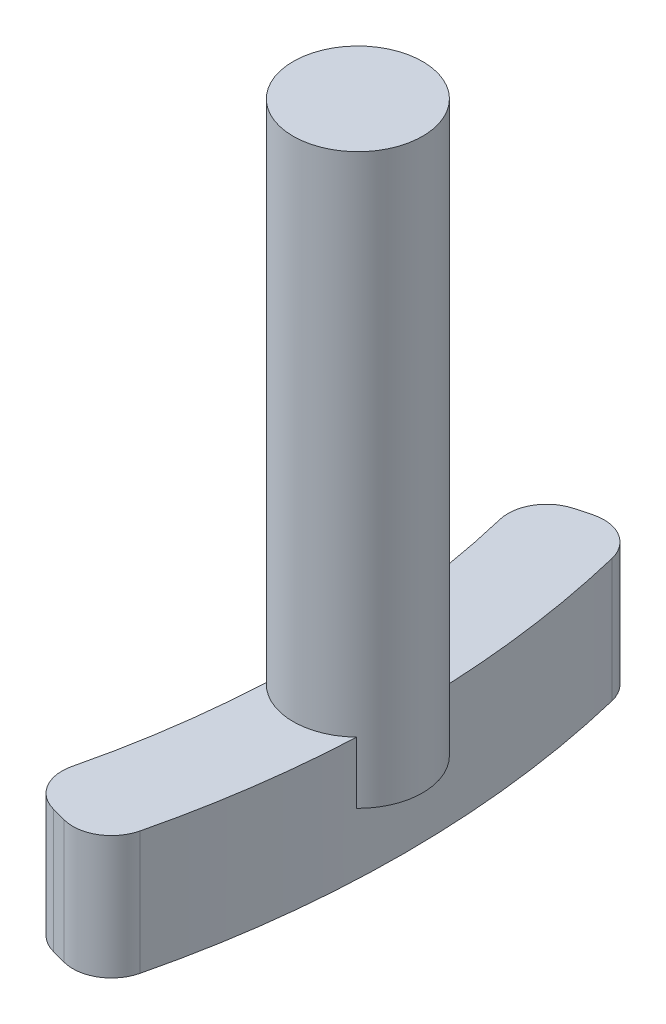
ISO-10303-21;
HEADER;
FILE_DESCRIPTION(('STEP AP214'),'2;1');
FILE_NAME('part.step','',(''),(''),'','','');
FILE_SCHEMA(('AUTOMOTIVE_DESIGN { 1 0 10303 214 1 1 1 1 }'));
ENDSEC;
DATA;
#1=APPLICATION_CONTEXT('core data for automotive mechanical design processes');
#2=APPLICATION_PROTOCOL_DEFINITION('international standard','automotive_design',2000,#1);
#3=PRODUCT_CONTEXT('',#1,'mechanical');
#4=PRODUCT('Part','Part','',(#3));
#5=PRODUCT_RELATED_PRODUCT_CATEGORY('part','',(#4));
#6=PRODUCT_DEFINITION_FORMATION('','',#4);
#7=PRODUCT_DEFINITION_CONTEXT('part definition',#1,'design');
#8=PRODUCT_DEFINITION('design','',#6,#7);
#9=PRODUCT_DEFINITION_SHAPE('','',#8);
#10=(LENGTH_UNIT() NAMED_UNIT(*) SI_UNIT(.MILLI.,.METRE.));
#11=(NAMED_UNIT(*) PLANE_ANGLE_UNIT() SI_UNIT($,.RADIAN.));
#12=(NAMED_UNIT(*) SI_UNIT($,.STERADIAN.) SOLID_ANGLE_UNIT());
#13=UNCERTAINTY_MEASURE_WITH_UNIT(LENGTH_MEASURE(1.E-05),#10,'distance_accuracy_value','');
#14=(GEOMETRIC_REPRESENTATION_CONTEXT(3) GLOBAL_UNCERTAINTY_ASSIGNED_CONTEXT((#13)) GLOBAL_UNIT_ASSIGNED_CONTEXT((#10,
#11,#12)) REPRESENTATION_CONTEXT('',''));
#15=CARTESIAN_POINT('',(0.,0.,0.));
#16=DIRECTION('',(0.,0.,1.));
#17=DIRECTION('',(1.,0.,0.));
#18=AXIS2_PLACEMENT_3D('',#15,#16,#17);
#19=CARTESIAN_POINT('',(-30.5687487202427,4.,2.05143520629854E-13));
#20=DIRECTION('',(0.,-1.,0.));
#21=DIRECTION('',(0.,0.,-1.));
#22=AXIS2_PLACEMENT_3D('',#19,#20,#21);
#23=CYLINDRICAL_SURFACE('',#22,29.4999999999999);
#24=DIRECTION('',(0.,-1.,0.));
#25=VECTOR('',#24,1.);
#26=CARTESIAN_POINT('',(-1.10358742992017,11.22,1.43327252651965));
#27=LINE('',#26,#25);
#28=CARTESIAN_POINT('',(-1.10358742992019,2.,1.43327252651963));
#29=VERTEX_POINT('',#28);
#30=CARTESIAN_POINT('',(-1.1035874299202,4.,1.43327252651967));
#31=VERTEX_POINT('',#30);
#32=EDGE_CURVE('E48',#29,#31,#27,.F.);
#33=ORIENTED_EDGE('',*,*,#32,.F.);
#34=CARTESIAN_POINT('',(-30.5687487202427,2.,2.05143520629854E-13));
#35=DIRECTION('',(0.,1.,0.));
#36=DIRECTION('',(0.,0.,1.));
#37=AXIS2_PLACEMENT_3D('',#34,#35,#36);
#38=CIRCLE('',#37,29.4999999999999);
#39=CARTESIAN_POINT('',(-1.10358742992021,2.,-1.4332725265196));
#40=VERTEX_POINT('',#39);
#41=EDGE_CURVE('E151',#40,#29,#38,.F.);
#42=ORIENTED_EDGE('',*,*,#41,.F.);
#43=DIRECTION('',(0.,-1.,0.));
#44=VECTOR('',#43,1.);
#45=CARTESIAN_POINT('',(-1.10358742992019,11.22,-1.43327252651963));
#46=LINE('',#45,#44);
#47=CARTESIAN_POINT('',(-1.10358742992021,4.,-1.43327252651965));
#48=VERTEX_POINT('',#47);
#49=EDGE_CURVE('E221',#48,#40,#46,.T.);
#50=ORIENTED_EDGE('',*,*,#49,.F.);
#51=CARTESIAN_POINT('',(-30.5687487202427,4.,2.05143520629854E-13));
#52=DIRECTION('',(0.,-1.,0.));
#53=DIRECTION('',(0.,0.,1.));
#54=AXIS2_PLACEMENT_3D('',#51,#52,#53);
#55=CIRCLE('',#54,29.4999999999999);
#56=CARTESIAN_POINT('',(-1.8961902001021,4.,-6.93789506328148));
#57=VERTEX_POINT('',#56);
#58=EDGE_CURVE('E99',#57,#48,#55,.T.);
#59=ORIENTED_EDGE('',*,*,#58,.F.);
#60=DIRECTION('',(0.,-1.,0.));
#61=VECTOR('',#60,1.);
#62=CARTESIAN_POINT('',(-1.8961902001021,4.,-6.93789506328148));
#63=LINE('',#62,#61);
#64=CARTESIAN_POINT('',(-1.8961902001021,0.,-6.93789506328148));
#65=VERTEX_POINT('',#64);
#66=EDGE_CURVE('E176',#57,#65,#63,.T.);
#67=ORIENTED_EDGE('',*,*,#66,.T.);
#68=CARTESIAN_POINT('',(-30.5687487202427,0.,2.05143520629854E-13));
#69=DIRECTION('',(0.,-1.,0.));
#70=DIRECTION('',(0.,0.,1.));
#71=AXIS2_PLACEMENT_3D('',#68,#69,#70);
#72=CIRCLE('',#71,29.4999999999999);
#73=CARTESIAN_POINT('',(-1.8961902001028,0.,6.9378950632813));
#74=VERTEX_POINT('',#73);
#75=EDGE_CURVE('E150',#65,#74,#72,.T.);
#76=ORIENTED_EDGE('',*,*,#75,.T.);
#77=DIRECTION('',(0.,-1.,0.));
#78=VECTOR('',#77,1.);
#79=CARTESIAN_POINT('',(-1.8961902001028,4.,6.9378950632813));
#80=LINE('',#79,#78);
#81=CARTESIAN_POINT('',(-1.8961902001028,4.,6.9378950632813));
#82=VERTEX_POINT('',#81);
#83=EDGE_CURVE('E173',#82,#74,#80,.T.);
#84=ORIENTED_EDGE('',*,*,#83,.F.);
#85=EDGE_CURVE('E181',#31,#82,#55,.T.);
#86=ORIENTED_EDGE('',*,*,#85,.F.);
#87=EDGE_LOOP('',(#33,#42,#50,#59,#67,#76,#84,#86));
#88=FACE_BOUND('',#87,.T.);
#89=ADVANCED_FACE('F33',(#88),#23,.F.);
#90=CARTESIAN_POINT('',(-30.5687487202427,4.,2.05143520629854E-13));
#91=DIRECTION('',(0.,-1.,0.));
#92=DIRECTION('',(0.,0.,-1.));
#93=AXIS2_PLACEMENT_3D('',#90,#91,#92);
#94=CYLINDRICAL_SURFACE('',#93,32.5);
#95=DIRECTION('',(0.,-1.,0.));
#96=VECTOR('',#95,1.);
#97=CARTESIAN_POINT('',(1.89641257007984,11.22,1.50442759657619));
#98=LINE('',#97,#96);
#99=CARTESIAN_POINT('',(1.89641257007988,4.,1.50442759657623));
#100=VERTEX_POINT('',#99);
#101=CARTESIAN_POINT('',(1.89641257007988,2.,1.50442759657614));
#102=VERTEX_POINT('',#101);
#103=EDGE_CURVE('E204',#100,#102,#98,.T.);
#104=ORIENTED_EDGE('',*,*,#103,.F.);
#105=CARTESIAN_POINT('',(-30.5687487202427,4.,2.05143520629854E-13));
#106=DIRECTION('',(0.,1.,0.));
#107=DIRECTION('',(0.,0.,1.));
#108=AXIS2_PLACEMENT_3D('',#105,#106,#107);
#109=CIRCLE('',#108,32.5);
#110=CARTESIAN_POINT('',(1.01667712130941,4.,7.65577392611712));
#111=VERTEX_POINT('',#110);
#112=EDGE_CURVE('E125',#111,#100,#109,.T.);
#113=ORIENTED_EDGE('',*,*,#112,.F.);
#114=DIRECTION('',(0.,-1.,0.));
#115=VECTOR('',#114,1.);
#116=CARTESIAN_POINT('',(1.01667712130941,4.,7.65577392611712));
#117=LINE('',#116,#115);
#118=CARTESIAN_POINT('',(1.01667712130941,0.,7.65577392611712));
#119=VERTEX_POINT('',#118);
#120=EDGE_CURVE('E137',#111,#119,#117,.T.);
#121=ORIENTED_EDGE('',*,*,#120,.T.);
#122=CARTESIAN_POINT('',(-30.5687487202427,0.,2.05143520629854E-13));
#123=DIRECTION('',(0.,1.,0.));
#124=DIRECTION('',(0.,0.,1.));
#125=AXIS2_PLACEMENT_3D('',#122,#123,#124);
#126=CIRCLE('',#125,32.5);
#127=CARTESIAN_POINT('',(1.01667712130929,0.,-7.65577392611716));
#128=VERTEX_POINT('',#127);
#129=EDGE_CURVE('E134',#119,#128,#126,.T.);
#130=ORIENTED_EDGE('',*,*,#129,.T.);
#131=DIRECTION('',(0.,-1.,0.));
#132=VECTOR('',#131,1.);
#133=CARTESIAN_POINT('',(1.01667712130929,4.,-7.65577392611716));
#134=LINE('',#133,#132);
#135=CARTESIAN_POINT('',(1.01667712130929,4.,-7.65577392611716));
#136=VERTEX_POINT('',#135);
#137=EDGE_CURVE('E129',#136,#128,#134,.T.);
#138=ORIENTED_EDGE('',*,*,#137,.F.);
#139=CARTESIAN_POINT('',(1.89641257007986,4.,-1.50442759657624));
#140=VERTEX_POINT('',#139);
#141=EDGE_CURVE('E116',#140,#136,#109,.T.);
#142=ORIENTED_EDGE('',*,*,#141,.F.);
#143=DIRECTION('',(0.,-1.,0.));
#144=VECTOR('',#143,1.);
#145=CARTESIAN_POINT('',(1.89641257007982,11.22,-1.5044275965762));
#146=LINE('',#145,#144);
#147=CARTESIAN_POINT('',(1.89641257007986,2.,-1.50442759657616));
#148=VERTEX_POINT('',#147);
#149=EDGE_CURVE('E212',#148,#140,#146,.F.);
#150=ORIENTED_EDGE('',*,*,#149,.F.);
#151=CARTESIAN_POINT('',(-30.5687487202427,2.,2.05143520629854E-13));
#152=DIRECTION('',(0.,1.,0.));
#153=DIRECTION('',(0.,0.,1.));
#154=AXIS2_PLACEMENT_3D('',#151,#152,#153);
#155=CIRCLE('',#154,32.5);
#156=EDGE_CURVE('E11',#102,#148,#155,.T.);
#157=ORIENTED_EDGE('',*,*,#156,.F.);
#158=EDGE_LOOP('',(#104,#113,#121,#130,#138,#142,#150,#157));
#159=FACE_BOUND('',#158,.T.);
#160=ADVANCED_FACE('F131',(#159),#94,.T.);
#161=CARTESIAN_POINT('',(-0.681251279757095,4.,-7.23187366765784));
#162=DIRECTION('',(0.,1.,0.));
#163=DIRECTION('',(0.,0.,1.));
#164=AXIS2_PLACEMENT_3D('',#161,#162,#163);
#165=PLANE('',#164);
#166=ORIENTED_EDGE('',*,*,#58,.T.);
#167=CARTESIAN_POINT('',(0.431251279757166,4.,0.));
#168=DIRECTION('',(0.,1.,0.));
#169=DIRECTION('',(0.,0.,1.));
#170=AXIS2_PLACEMENT_3D('',#167,#168,#169);
#171=CIRCLE('',#170,2.1);
#172=EDGE_CURVE('E41',#48,#140,#171,.F.);
#173=ORIENTED_EDGE('',*,*,#172,.T.);
#174=ORIENTED_EDGE('',*,*,#141,.T.);
#175=CARTESIAN_POINT('',(-0.198146949519636,4.,-7.36132108280495));
#176=DIRECTION('',(0.,1.,0.));
#177=DIRECTION('',(0.,0.,-1.));
#178=AXIS2_PLACEMENT_3D('',#175,#176,#177);
#179=CIRCLE('',#178,1.25);
#180=CARTESIAN_POINT('',(-0.521670755897788,4.,-8.56872836566629));
#181=VERTEX_POINT('',#180);
#182=EDGE_CURVE('E120',#136,#181,#179,.T.);
#183=ORIENTED_EDGE('',*,*,#182,.T.);
#184=DIRECTION('',(-0.965925826289066,0.,0.25881904510253));
#185=VECTOR('',#184,1.);
#186=CARTESIAN_POINT('',(-1.00477508613525,4.,-8.43928095051918));
#187=LINE('',#186,#185);
#188=CARTESIAN_POINT('',(-1.00477508613525,4.,-8.43928095051918));
#189=VERTEX_POINT('',#188);
#190=EDGE_CURVE('E57',#181,#189,#187,.T.);
#191=ORIENTED_EDGE('',*,*,#190,.T.);
#192=CARTESIAN_POINT('',(-0.681251279757095,4.,-7.23187366765784));
#193=DIRECTION('',(0.,1.,0.));
#194=DIRECTION('',(0.,0.,1.));
#195=AXIS2_PLACEMENT_3D('',#192,#193,#194);
#196=CIRCLE('',#195,1.25);
#197=EDGE_CURVE('E163',#189,#57,#196,.T.);
#198=ORIENTED_EDGE('',*,*,#197,.T.);
#199=EDGE_LOOP('',(#166,#173,#174,#183,#191,#198));
#200=FACE_BOUND('',#199,.T.);
#201=ADVANCED_FACE('F118',(#200),#165,.T.);
#202=CARTESIAN_POINT('',(-0.681251279757095,4.,-7.23187366765784));
#203=DIRECTION('',(0.,-1.,0.));
#204=DIRECTION('',(0.,0.,-1.));
#205=AXIS2_PLACEMENT_3D('',#202,#203,#204);
#206=CYLINDRICAL_SURFACE('',#205,1.25);
#207=CARTESIAN_POINT('',(-0.681251279757095,0.,-7.23187366765784));
#208=DIRECTION('',(0.,1.,0.));
#209=DIRECTION('',(0.,0.,1.));
#210=AXIS2_PLACEMENT_3D('',#207,#208,#209);
#211=CIRCLE('',#210,1.25);
#212=CARTESIAN_POINT('',(-1.00477508613525,0.,-8.43928095051918));
#213=VERTEX_POINT('',#212);
#214=EDGE_CURVE('E147',#213,#65,#211,.T.);
#215=ORIENTED_EDGE('',*,*,#214,.T.);
#216=ORIENTED_EDGE('',*,*,#66,.F.);
#217=ORIENTED_EDGE('',*,*,#197,.F.);
#218=DIRECTION('',(0.,-1.,0.));
#219=VECTOR('',#218,1.);
#220=CARTESIAN_POINT('',(-1.00477508613525,4.,-8.43928095051918));
#221=LINE('',#220,#219);
#222=EDGE_CURVE('E142',#189,#213,#221,.T.);
#223=ORIENTED_EDGE('',*,*,#222,.T.);
#224=EDGE_LOOP('',(#215,#216,#217,#223));
#225=FACE_BOUND('',#224,.T.);
#226=ADVANCED_FACE('F35',(#225),#206,.T.);
#227=CARTESIAN_POINT('',(-0.681251279756994,4.,7.23187366765784));
#228=DIRECTION('',(0.,-1.,0.));
#229=DIRECTION('',(0.,0.,-1.));
#230=AXIS2_PLACEMENT_3D('',#227,#228,#229);
#231=CYLINDRICAL_SURFACE('',#230,1.25000000000088);
#232=CARTESIAN_POINT('',(-0.681251279756994,0.,7.23187366765784));
#233=DIRECTION('',(0.,1.,0.));
#234=DIRECTION('',(0.,0.,-1.));
#235=AXIS2_PLACEMENT_3D('',#232,#233,#234);
#236=CIRCLE('',#235,1.25000000000088);
#237=CARTESIAN_POINT('',(-1.00477508613512,0.,8.43928095052089));
#238=VERTEX_POINT('',#237);
#239=EDGE_CURVE('E153',#74,#238,#236,.T.);
#240=ORIENTED_EDGE('',*,*,#239,.T.);
#241=DIRECTION('',(0.,-1.,0.));
#242=VECTOR('',#241,1.);
#243=CARTESIAN_POINT('',(-1.00477508613512,4.,8.43928095052089));
#244=LINE('',#243,#242);
#245=CARTESIAN_POINT('',(-1.00477508613512,4.,8.43928095052089));
#246=VERTEX_POINT('',#245);
#247=EDGE_CURVE('E170',#246,#238,#244,.T.);
#248=ORIENTED_EDGE('',*,*,#247,.F.);
#249=CARTESIAN_POINT('',(-0.681251279756994,4.,7.23187366765784));
#250=DIRECTION('',(0.,1.,0.));
#251=DIRECTION('',(0.,0.,-1.));
#252=AXIS2_PLACEMENT_3D('',#249,#250,#251);
#253=CIRCLE('',#252,1.25000000000088);
#254=EDGE_CURVE('E190',#82,#246,#253,.T.);
#255=ORIENTED_EDGE('',*,*,#254,.F.);
#256=ORIENTED_EDGE('',*,*,#83,.T.);
#257=EDGE_LOOP('',(#240,#248,#255,#256));
#258=FACE_BOUND('',#257,.T.);
#259=ADVANCED_FACE('F244',(#258),#231,.T.);
#260=CARTESIAN_POINT('',(-1.00477508613512,4.,8.43928095052089));
#261=DIRECTION('',(0.258819045102156,0.,-0.965925826289166));
#262=DIRECTION('',(-0.965925826289166,0.,-0.258819045102156));
#263=AXIS2_PLACEMENT_3D('',#260,#261,#262);
#264=PLANE('',#263);
#265=DIRECTION('',(0.965925826289166,0.,0.258819045102156));
#266=VECTOR('',#265,1.);
#267=CARTESIAN_POINT('',(-1.00477508613512,0.,8.43928095052089));
#268=LINE('',#267,#266);
#269=CARTESIAN_POINT('',(-0.521670755897483,0.,8.56872836566709));
#270=VERTEX_POINT('',#269);
#271=EDGE_CURVE('E155',#238,#270,#268,.T.);
#272=ORIENTED_EDGE('',*,*,#271,.T.);
#273=DIRECTION('',(0.,-1.,0.));
#274=VECTOR('',#273,1.);
#275=CARTESIAN_POINT('',(-0.521670755897483,4.,8.56872836566709));
#276=LINE('',#275,#274);
#277=CARTESIAN_POINT('',(-0.521670755897483,4.,8.56872836566709));
#278=VERTEX_POINT('',#277);
#279=EDGE_CURVE('E167',#278,#270,#276,.T.);
#280=ORIENTED_EDGE('',*,*,#279,.F.);
#281=DIRECTION('',(0.965925826289166,0.,0.258819045102156));
#282=VECTOR('',#281,1.);
#283=CARTESIAN_POINT('',(-1.00477508613512,4.,8.43928095052089));
#284=LINE('',#283,#282);
#285=EDGE_CURVE('E195',#246,#278,#284,.T.);
#286=ORIENTED_EDGE('',*,*,#285,.F.);
#287=ORIENTED_EDGE('',*,*,#247,.T.);
#288=EDGE_LOOP('',(#272,#280,#286,#287));
#289=FACE_BOUND('',#288,.T.);
#290=ADVANCED_FACE('F249',(#289),#264,.F.);
#291=CARTESIAN_POINT('',(-0.198146949519533,4.,7.36132108280494));
#292=DIRECTION('',(0.,-1.,0.));
#293=DIRECTION('',(0.,0.,-1.));
#294=AXIS2_PLACEMENT_3D('',#291,#292,#293);
#295=CYLINDRICAL_SURFACE('',#294,1.25000000000074);
#296=CARTESIAN_POINT('',(-0.198146949519533,0.,7.36132108280494));
#297=DIRECTION('',(0.,1.,0.));
#298=DIRECTION('',(0.,0.,-1.));
#299=AXIS2_PLACEMENT_3D('',#296,#297,#298);
#300=CIRCLE('',#299,1.25000000000074);
#301=EDGE_CURVE('E157',#270,#119,#300,.T.);
#302=ORIENTED_EDGE('',*,*,#301,.T.);
#303=ORIENTED_EDGE('',*,*,#120,.F.);
#304=CARTESIAN_POINT('',(-0.198146949519533,4.,7.36132108280494));
#305=DIRECTION('',(0.,1.,0.));
#306=DIRECTION('',(0.,0.,-1.));
#307=AXIS2_PLACEMENT_3D('',#304,#305,#306);
#308=CIRCLE('',#307,1.25000000000074);
#309=EDGE_CURVE('E126',#278,#111,#308,.T.);
#310=ORIENTED_EDGE('',*,*,#309,.F.);
#311=ORIENTED_EDGE('',*,*,#279,.T.);
#312=EDGE_LOOP('',(#302,#303,#310,#311));
#313=FACE_BOUND('',#312,.T.);
#314=ADVANCED_FACE('F201',(#313),#295,.T.);
#315=CARTESIAN_POINT('',(-0.198146949519636,4.,-7.36132108280495));
#316=DIRECTION('',(0.,-1.,0.));
#317=DIRECTION('',(0.,0.,-1.));
#318=AXIS2_PLACEMENT_3D('',#315,#316,#317);
#319=CYLINDRICAL_SURFACE('',#318,1.25);
#320=CARTESIAN_POINT('',(-0.198146949519636,0.,-7.36132108280495));
#321=DIRECTION('',(0.,1.,0.));
#322=DIRECTION('',(0.,0.,-1.));
#323=AXIS2_PLACEMENT_3D('',#320,#321,#322);
#324=CIRCLE('',#323,1.25);
#325=CARTESIAN_POINT('',(-0.521670755897788,0.,-8.56872836566629));
#326=VERTEX_POINT('',#325);
#327=EDGE_CURVE('E160',#128,#326,#324,.T.);
#328=ORIENTED_EDGE('',*,*,#327,.T.);
#329=DIRECTION('',(0.,-1.,0.));
#330=VECTOR('',#329,1.);
#331=CARTESIAN_POINT('',(-0.521670755897788,4.,-8.56872836566629));
#332=LINE('',#331,#330);
#333=EDGE_CURVE('E138',#181,#326,#332,.T.);
#334=ORIENTED_EDGE('',*,*,#333,.F.);
#335=ORIENTED_EDGE('',*,*,#182,.F.);
#336=ORIENTED_EDGE('',*,*,#137,.T.);
#337=EDGE_LOOP('',(#328,#334,#335,#336));
#338=FACE_BOUND('',#337,.T.);
#339=ADVANCED_FACE('F140',(#338),#319,.T.);
#340=CARTESIAN_POINT('',(-1.00477508613525,4.,-8.43928095051918));
#341=DIRECTION('',(0.25881904510253,0.,0.965925826289066));
#342=DIRECTION('',(0.965925826289066,0.,-0.25881904510253));
#343=AXIS2_PLACEMENT_3D('',#340,#341,#342);
#344=PLANE('',#343);
#345=DIRECTION('',(-0.965925826289066,0.,0.25881904510253));
#346=VECTOR('',#345,1.);
#347=CARTESIAN_POINT('',(-1.00477508613525,0.,-8.43928095051918));
#348=LINE('',#347,#346);
#349=EDGE_CURVE('E90',#326,#213,#348,.T.);
#350=ORIENTED_EDGE('',*,*,#349,.T.);
#351=ORIENTED_EDGE('',*,*,#222,.F.);
#352=ORIENTED_EDGE('',*,*,#190,.F.);
#353=ORIENTED_EDGE('',*,*,#333,.T.);
#354=EDGE_LOOP('',(#350,#351,#352,#353));
#355=FACE_BOUND('',#354,.T.);
#356=ADVANCED_FACE('F270',(#355),#344,.F.);
#357=ORIENTED_EDGE('',*,*,#112,.T.);
#358=EDGE_CURVE('E177',#100,#31,#171,.F.);
#359=ORIENTED_EDGE('',*,*,#358,.T.);
#360=ORIENTED_EDGE('',*,*,#85,.T.);
#361=ORIENTED_EDGE('',*,*,#254,.T.);
#362=ORIENTED_EDGE('',*,*,#285,.T.);
#363=ORIENTED_EDGE('',*,*,#309,.T.);
#364=EDGE_LOOP('',(#357,#359,#360,#361,#362,#363));
#365=FACE_BOUND('',#364,.T.);
#366=ADVANCED_FACE('F180',(#365),#165,.T.);
#367=CARTESIAN_POINT('',(-0.681251279757095,0.,-7.23187366765784));
#368=DIRECTION('',(0.,1.,0.));
#369=DIRECTION('',(0.,0.,1.));
#370=AXIS2_PLACEMENT_3D('',#367,#368,#369);
#371=PLANE('',#370);
#372=ORIENTED_EDGE('',*,*,#214,.F.);
#373=ORIENTED_EDGE('',*,*,#349,.F.);
#374=ORIENTED_EDGE('',*,*,#327,.F.);
#375=ORIENTED_EDGE('',*,*,#129,.F.);
#376=ORIENTED_EDGE('',*,*,#301,.F.);
#377=ORIENTED_EDGE('',*,*,#271,.F.);
#378=ORIENTED_EDGE('',*,*,#239,.F.);
#379=ORIENTED_EDGE('',*,*,#75,.F.);
#380=EDGE_LOOP('',(#372,#373,#374,#375,#376,#377,#378,#379));
#381=FACE_BOUND('',#380,.T.);
#382=ADVANCED_FACE('F247',(#381),#371,.F.);
#383=CARTESIAN_POINT('',(0.431251279757166,2.,0.));
#384=DIRECTION('',(0.,1.,0.));
#385=DIRECTION('',(0.,0.,1.));
#386=AXIS2_PLACEMENT_3D('',#383,#384,#385);
#387=PLANE('',#386);
#388=CARTESIAN_POINT('',(0.431251279757166,2.,0.));
#389=DIRECTION('',(0.,1.,0.));
#390=DIRECTION('',(0.,0.,1.));
#391=AXIS2_PLACEMENT_3D('',#388,#389,#390);
#392=CIRCLE('',#391,2.1);
#393=EDGE_CURVE('E228',#40,#29,#392,.T.);
#394=ORIENTED_EDGE('',*,*,#393,.F.);
#395=ORIENTED_EDGE('',*,*,#41,.T.);
#396=EDGE_LOOP('',(#394,#395));
#397=FACE_BOUND('',#396,.T.);
#398=ADVANCED_FACE('F226',(#397),#387,.F.);
#399=CARTESIAN_POINT('',(0.431251279757166,20.44,0.));
#400=DIRECTION('',(0.,-1.,0.));
#401=DIRECTION('',(0.,0.,-1.));
#402=AXIS2_PLACEMENT_3D('',#399,#400,#401);
#403=CYLINDRICAL_SURFACE('',#402,2.1);
#404=CARTESIAN_POINT('',(0.431251279757166,20.44,0.));
#405=DIRECTION('',(0.,1.,0.));
#406=DIRECTION('',(0.,0.,1.));
#407=AXIS2_PLACEMENT_3D('',#404,#405,#406);
#408=CIRCLE('',#407,2.1);
#409=CARTESIAN_POINT('',(0.431251279757166,20.44,2.1));
#410=VERTEX_POINT('',#409);
#411=EDGE_CURVE('E210',#410,#410,#408,.T.);
#412=ORIENTED_EDGE('',*,*,#411,.F.);
#413=EDGE_LOOP('',(#412));
#414=FACE_BOUND('',#413,.T.);
#415=ORIENTED_EDGE('',*,*,#172,.F.);
#416=ORIENTED_EDGE('',*,*,#49,.T.);
#417=ORIENTED_EDGE('',*,*,#393,.T.);
#418=ORIENTED_EDGE('',*,*,#32,.T.);
#419=ORIENTED_EDGE('',*,*,#358,.F.);
#420=ORIENTED_EDGE('',*,*,#103,.T.);
#421=EDGE_CURVE('E215',#102,#148,#392,.T.);
#422=ORIENTED_EDGE('',*,*,#421,.T.);
#423=ORIENTED_EDGE('',*,*,#149,.T.);
#424=EDGE_LOOP('',(#415,#416,#417,#418,#419,#420,#422,#423));
#425=FACE_BOUND('',#424,.T.);
#426=ADVANCED_FACE('F230',(#414,#425),#403,.T.);
#427=CARTESIAN_POINT('',(0.431251279757166,20.44,0.));
#428=DIRECTION('',(0.,1.,0.));
#429=DIRECTION('',(0.,0.,1.));
#430=AXIS2_PLACEMENT_3D('',#427,#428,#429);
#431=PLANE('',#430);
#432=ORIENTED_EDGE('',*,*,#411,.T.);
#433=EDGE_LOOP('',(#432));
#434=FACE_BOUND('',#433,.T.);
#435=ADVANCED_FACE('F278',(#434),#431,.T.);
#436=ORIENTED_EDGE('',*,*,#421,.F.);
#437=ORIENTED_EDGE('',*,*,#156,.T.);
#438=EDGE_LOOP('',(#436,#437));
#439=FACE_BOUND('',#438,.T.);
#440=ADVANCED_FACE('F234',(#439),#387,.F.);
#441=CLOSED_SHELL('',(#89,#160,#201,#226,#259,#290,#314,#339,#356,#366,#382,#398,#426,#435,#440));
#442=MANIFOLD_SOLID_BREP('B2',#441);
#443=ADVANCED_BREP_SHAPE_REPRESENTATION('',(#18,#442),#14);
#444=SHAPE_DEFINITION_REPRESENTATION(#9,#443);
ENDSEC;
END-ISO-10303-21;
